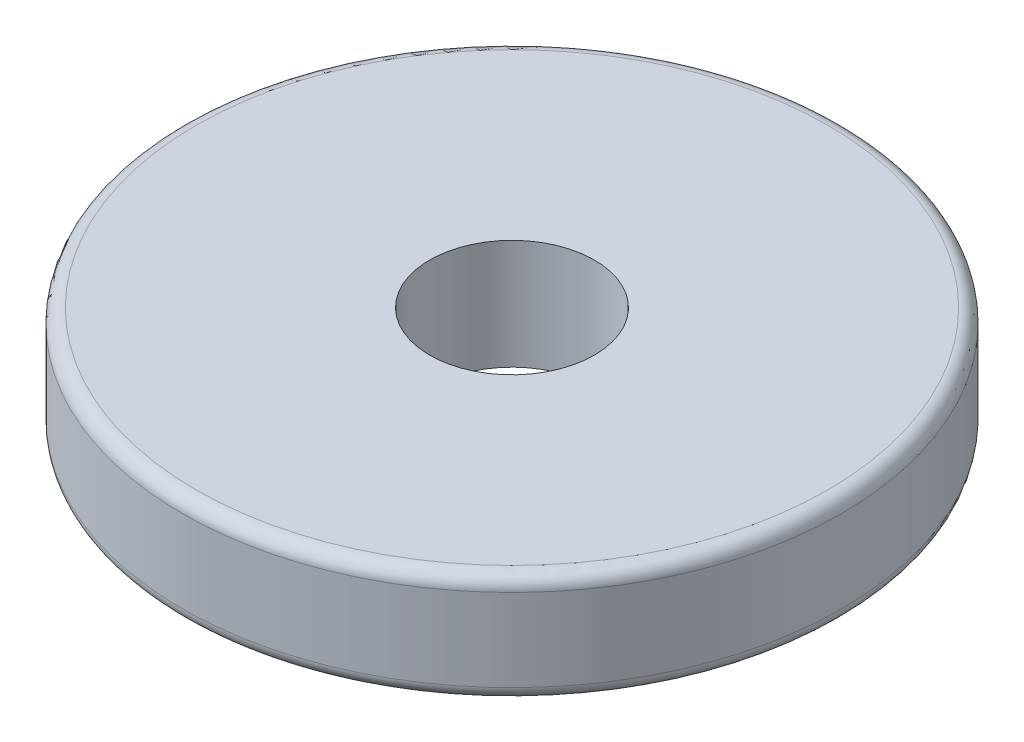
ISO-10303-21;
HEADER;
FILE_DESCRIPTION(('STEP AP214'),'2;1');
FILE_NAME('part.step','',(''),(''),'','','');
FILE_SCHEMA(('AUTOMOTIVE_DESIGN { 1 0 10303 214 1 1 1 1 }'));
ENDSEC;
DATA;
#1=APPLICATION_CONTEXT('core data for automotive mechanical design processes');
#2=APPLICATION_PROTOCOL_DEFINITION('international standard','automotive_design',2000,#1);
#3=PRODUCT_CONTEXT('',#1,'mechanical');
#4=PRODUCT('Part','Part','',(#3));
#5=PRODUCT_RELATED_PRODUCT_CATEGORY('part','',(#4));
#6=PRODUCT_DEFINITION_FORMATION('','',#4);
#7=PRODUCT_DEFINITION_CONTEXT('part definition',#1,'design');
#8=PRODUCT_DEFINITION('design','',#6,#7);
#9=PRODUCT_DEFINITION_SHAPE('','',#8);
#10=(LENGTH_UNIT() NAMED_UNIT(*) SI_UNIT(.MILLI.,.METRE.));
#11=(NAMED_UNIT(*) PLANE_ANGLE_UNIT() SI_UNIT($,.RADIAN.));
#12=(NAMED_UNIT(*) SI_UNIT($,.STERADIAN.) SOLID_ANGLE_UNIT());
#13=UNCERTAINTY_MEASURE_WITH_UNIT(LENGTH_MEASURE(1.E-05),#10,'distance_accuracy_value','');
#14=(GEOMETRIC_REPRESENTATION_CONTEXT(3) GLOBAL_UNCERTAINTY_ASSIGNED_CONTEXT((#13)) GLOBAL_UNIT_ASSIGNED_CONTEXT((#10,
#11,#12)) REPRESENTATION_CONTEXT('',''));
#15=CARTESIAN_POINT('',(0.,0.,0.));
#16=DIRECTION('',(0.,0.,1.));
#17=DIRECTION('',(1.,0.,0.));
#18=AXIS2_PLACEMENT_3D('',#15,#16,#17);
#19=CARTESIAN_POINT('',(28.75,5.00000000000004,0.));
#20=DIRECTION('',(0.,1.,0.));
#21=DIRECTION('',(-1.,0.,0.));
#22=AXIS2_PLACEMENT_3D('',#19,#20,#21);
#23=PLANE('',#22);
#24=CARTESIAN_POINT('',(0.,5.,0.));
#25=DIRECTION('',(0.,-1.,0.));
#26=DIRECTION('',(1.,0.,0.));
#27=AXIS2_PLACEMENT_3D('',#24,#25,#26);
#28=CIRCLE('',#27,7.50000000000002);
#29=CARTESIAN_POINT('',(7.5,5.00000000000003,0.));
#30=VERTEX_POINT('',#29);
#31=EDGE_CURVE('E10',#30,#30,#28,.T.);
#32=ORIENTED_EDGE('',*,*,#31,.T.);
#33=EDGE_LOOP('',(#32));
#34=FACE_BOUND('',#33,.T.);
#35=CARTESIAN_POINT('',(0.,4.99999999999989,0.));
#36=DIRECTION('',(0.,-1.,0.));
#37=DIRECTION('',(1.,0.,0.));
#38=AXIS2_PLACEMENT_3D('',#35,#36,#37);
#39=CIRCLE('',#38,28.75);
#40=CARTESIAN_POINT('',(28.75,4.99999999999999,0.));
#41=VERTEX_POINT('',#40);
#42=EDGE_CURVE('E57',#41,#41,#39,.T.);
#43=ORIENTED_EDGE('',*,*,#42,.F.);
#44=EDGE_LOOP('',(#43));
#45=FACE_BOUND('',#44,.T.);
#46=ADVANCED_FACE('F34',(#34,#45),#23,.T.);
#47=CARTESIAN_POINT('',(1.18829503014473E-12,-346.416551839449,0.));
#48=DIRECTION('',(0.,-1.,0.));
#49=DIRECTION('',(1.,0.,0.));
#50=AXIS2_PLACEMENT_3D('',#47,#48,#49);
#51=CYLINDRICAL_SURFACE('',#50,7.5);
#52=CARTESIAN_POINT('',(0.,-5.,0.));
#53=DIRECTION('',(0.,-1.,0.));
#54=DIRECTION('',(1.,0.,0.));
#55=AXIS2_PLACEMENT_3D('',#52,#53,#54);
#56=CIRCLE('',#55,7.49999999999998);
#57=CARTESIAN_POINT('',(7.5,-4.99999999999998,0.));
#58=VERTEX_POINT('',#57);
#59=EDGE_CURVE('E41',#58,#58,#56,.T.);
#60=ORIENTED_EDGE('',*,*,#59,.T.);
#61=EDGE_LOOP('',(#60));
#62=FACE_BOUND('',#61,.T.);
#63=ORIENTED_EDGE('',*,*,#31,.F.);
#64=EDGE_LOOP('',(#63));
#65=FACE_BOUND('',#64,.T.);
#66=ADVANCED_FACE('F113',(#62,#65),#51,.F.);
#67=CARTESIAN_POINT('',(7.5,-5.00000000000004,0.));
#68=DIRECTION('',(0.,-1.,0.));
#69=DIRECTION('',(1.,0.,0.));
#70=AXIS2_PLACEMENT_3D('',#67,#68,#69);
#71=PLANE('',#70);
#72=CARTESIAN_POINT('',(0.,-5.00000000000012,0.));
#73=DIRECTION('',(0.,-1.,0.));
#74=DIRECTION('',(1.,0.,0.));
#75=AXIS2_PLACEMENT_3D('',#72,#73,#74);
#76=CIRCLE('',#75,28.75);
#77=CARTESIAN_POINT('',(28.75,-5.00000000000002,0.));
#78=VERTEX_POINT('',#77);
#79=EDGE_CURVE('E45',#78,#78,#76,.T.);
#80=ORIENTED_EDGE('',*,*,#79,.T.);
#81=EDGE_LOOP('',(#80));
#82=FACE_BOUND('',#81,.T.);
#83=ORIENTED_EDGE('',*,*,#59,.F.);
#84=EDGE_LOOP('',(#83));
#85=FACE_BOUND('',#84,.T.);
#86=ADVANCED_FACE('F110',(#82,#85),#71,.T.);
#87=CARTESIAN_POINT('',(0.,-3.75000000000011,0.));
#88=DIRECTION('',(0.,-1.,0.));
#89=DIRECTION('',(1.,0.,0.));
#90=AXIS2_PLACEMENT_3D('',#87,#88,#89);
#91=TOROIDAL_SURFACE('',#90,28.75,1.25);
#92=CARTESIAN_POINT('',(0.,-3.75000000000009,0.));
#93=DIRECTION('',(0.,-1.,0.));
#94=DIRECTION('',(1.,0.,0.));
#95=AXIS2_PLACEMENT_3D('',#92,#93,#94);
#96=CIRCLE('',#95,30.);
#97=CARTESIAN_POINT('',(30.,-3.74999999999998,0.));
#98=VERTEX_POINT('',#97);
#99=EDGE_CURVE('E49',#98,#98,#96,.T.);
#100=ORIENTED_EDGE('',*,*,#99,.T.);
#101=EDGE_LOOP('',(#100));
#102=FACE_BOUND('',#101,.T.);
#103=ORIENTED_EDGE('',*,*,#79,.F.);
#104=EDGE_LOOP('',(#103));
#105=FACE_BOUND('',#104,.T.);
#106=ADVANCED_FACE('F106',(#102,#105),#91,.T.);
#107=CARTESIAN_POINT('',(1.18829503014473E-12,-346.416551839449,0.));
#108=DIRECTION('',(0.,-1.,0.));
#109=DIRECTION('',(1.,0.,0.));
#110=AXIS2_PLACEMENT_3D('',#107,#108,#109);
#111=CYLINDRICAL_SURFACE('',#110,30.);
#112=CARTESIAN_POINT('',(0.,3.74999999999986,0.));
#113=DIRECTION('',(0.,-1.,0.));
#114=DIRECTION('',(1.,0.,0.));
#115=AXIS2_PLACEMENT_3D('',#112,#113,#114);
#116=CIRCLE('',#115,30.);
#117=CARTESIAN_POINT('',(30.,3.74999999999997,0.));
#118=VERTEX_POINT('',#117);
#119=EDGE_CURVE('E54',#118,#118,#116,.T.);
#120=ORIENTED_EDGE('',*,*,#119,.T.);
#121=EDGE_LOOP('',(#120));
#122=FACE_BOUND('',#121,.T.);
#123=ORIENTED_EDGE('',*,*,#99,.F.);
#124=EDGE_LOOP('',(#123));
#125=FACE_BOUND('',#124,.T.);
#126=ADVANCED_FACE('F102',(#122,#125),#111,.T.);
#127=CARTESIAN_POINT('',(0.,3.74999999999989,0.));
#128=DIRECTION('',(0.,-1.,0.));
#129=DIRECTION('',(1.,0.,0.));
#130=AXIS2_PLACEMENT_3D('',#127,#128,#129);
#131=TOROIDAL_SURFACE('',#130,28.75,1.25000000000001);
#132=ORIENTED_EDGE('',*,*,#42,.T.);
#133=EDGE_LOOP('',(#132));
#134=FACE_BOUND('',#133,.T.);
#135=ORIENTED_EDGE('',*,*,#119,.F.);
#136=EDGE_LOOP('',(#135));
#137=FACE_BOUND('',#136,.T.);
#138=ADVANCED_FACE('F99',(#134,#137),#131,.T.);
#139=CLOSED_SHELL('',(#46,#66,#86,#106,#126,#138));
#140=CARTESIAN_POINT('',(1.18829503014473E-12,-346.416551839449,0.));
#141=DIRECTION('',(0.,-1.,0.));
#142=DIRECTION('',(1.,0.,0.));
#143=AXIS2_PLACEMENT_3D('',#140,#141,#142);
#144=CYLINDRICAL_SURFACE('',#143,28.5);
#145=CARTESIAN_POINT('',(0.,3.49999999999989,0.));
#146=DIRECTION('',(0.,-1.,0.));
#147=DIRECTION('',(1.,0.,0.));
#148=AXIS2_PLACEMENT_3D('',#145,#146,#147);
#149=CIRCLE('',#148,28.5);
#150=CARTESIAN_POINT('',(28.5,3.49999999999999,0.));
#151=VERTEX_POINT('',#150);
#152=EDGE_CURVE('E69',#151,#151,#149,.T.);
#153=ORIENTED_EDGE('',*,*,#152,.F.);
#154=EDGE_LOOP('',(#153));
#155=FACE_BOUND('',#154,.T.);
#156=CARTESIAN_POINT('',(0.,-3.50000000000011,0.));
#157=DIRECTION('',(0.,-1.,0.));
#158=DIRECTION('',(1.,0.,0.));
#159=AXIS2_PLACEMENT_3D('',#156,#157,#158);
#160=CIRCLE('',#159,28.5);
#161=CARTESIAN_POINT('',(28.5,-3.50000000000002,0.));
#162=VERTEX_POINT('',#161);
#163=EDGE_CURVE('E60',#162,#162,#160,.T.);
#164=ORIENTED_EDGE('',*,*,#163,.T.);
#165=EDGE_LOOP('',(#164));
#166=FACE_BOUND('',#165,.T.);
#167=ADVANCED_FACE('F75',(#155,#166),#144,.F.);
#168=CARTESIAN_POINT('',(9.,-3.50000000000003,0.));
#169=DIRECTION('',(0.,-1.,0.));
#170=DIRECTION('',(1.,0.,0.));
#171=AXIS2_PLACEMENT_3D('',#168,#169,#170);
#172=PLANE('',#171);
#173=ORIENTED_EDGE('',*,*,#163,.F.);
#174=EDGE_LOOP('',(#173));
#175=FACE_BOUND('',#174,.T.);
#176=CARTESIAN_POINT('',(0.,-3.50000000000006,0.));
#177=DIRECTION('',(0.,-1.,0.));
#178=DIRECTION('',(1.,0.,0.));
#179=AXIS2_PLACEMENT_3D('',#176,#177,#178);
#180=CIRCLE('',#179,8.99999999999999);
#181=CARTESIAN_POINT('',(9.,-3.50000000000003,0.));
#182=VERTEX_POINT('',#181);
#183=EDGE_CURVE('E63',#182,#182,#180,.T.);
#184=ORIENTED_EDGE('',*,*,#183,.T.);
#185=EDGE_LOOP('',(#184));
#186=FACE_BOUND('',#185,.T.);
#187=ADVANCED_FACE('F78',(#175,#186),#172,.F.);
#188=CARTESIAN_POINT('',(1.18829503014473E-12,-346.416551839449,0.));
#189=DIRECTION('',(0.,-1.,0.));
#190=DIRECTION('',(1.,0.,0.));
#191=AXIS2_PLACEMENT_3D('',#188,#189,#190);
#192=CYLINDRICAL_SURFACE('',#191,9.);
#193=ORIENTED_EDGE('',*,*,#183,.F.);
#194=EDGE_LOOP('',(#193));
#195=FACE_BOUND('',#194,.T.);
#196=CARTESIAN_POINT('',(0.,3.49999999999995,0.));
#197=DIRECTION('',(0.,-1.,0.));
#198=DIRECTION('',(1.,0.,0.));
#199=AXIS2_PLACEMENT_3D('',#196,#197,#198);
#200=CIRCLE('',#199,9.00000000000001);
#201=CARTESIAN_POINT('',(9.,3.49999999999998,0.));
#202=VERTEX_POINT('',#201);
#203=EDGE_CURVE('E66',#202,#202,#200,.T.);
#204=ORIENTED_EDGE('',*,*,#203,.T.);
#205=EDGE_LOOP('',(#204));
#206=FACE_BOUND('',#205,.T.);
#207=ADVANCED_FACE('F85',(#195,#206),#192,.T.);
#208=CARTESIAN_POINT('',(28.5,3.50000000000003,0.));
#209=DIRECTION('',(0.,1.,0.));
#210=DIRECTION('',(-1.,0.,0.));
#211=AXIS2_PLACEMENT_3D('',#208,#209,#210);
#212=PLANE('',#211);
#213=ORIENTED_EDGE('',*,*,#203,.F.);
#214=EDGE_LOOP('',(#213));
#215=FACE_BOUND('',#214,.T.);
#216=ORIENTED_EDGE('',*,*,#152,.T.);
#217=EDGE_LOOP('',(#216));
#218=FACE_BOUND('',#217,.T.);
#219=ADVANCED_FACE('F73',(#215,#218),#212,.F.);
#220=CLOSED_SHELL('',(#167,#187,#207,#219));
#221=ORIENTED_CLOSED_SHELL('',*,#220,.T.);
#222=BREP_WITH_VOIDS('B2',#139,(#221));
#223=ADVANCED_BREP_SHAPE_REPRESENTATION('',(#18,#222),#14);
#224=SHAPE_DEFINITION_REPRESENTATION(#9,#223);
ENDSEC;
END-ISO-10303-21;
